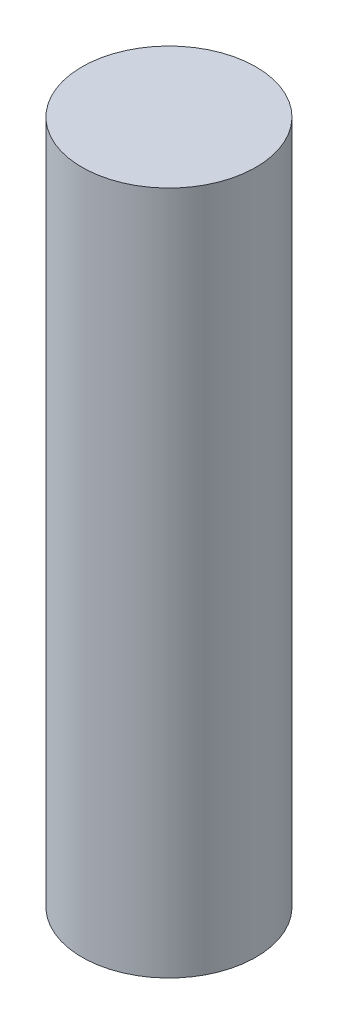
ISO-10303-21;
HEADER;
FILE_DESCRIPTION(('STEP AP214'),'2;1');
FILE_NAME('part.step','',(''),(''),'','','');
FILE_SCHEMA(('AUTOMOTIVE_DESIGN { 1 0 10303 214 1 1 1 1 }'));
ENDSEC;
DATA;
#1=APPLICATION_CONTEXT('core data for automotive mechanical design processes');
#2=APPLICATION_PROTOCOL_DEFINITION('international standard','automotive_design',2000,#1);
#3=PRODUCT_CONTEXT('',#1,'mechanical');
#4=PRODUCT('Part','Part','',(#3));
#5=PRODUCT_RELATED_PRODUCT_CATEGORY('part','',(#4));
#6=PRODUCT_DEFINITION_FORMATION('','',#4);
#7=PRODUCT_DEFINITION_CONTEXT('part definition',#1,'design');
#8=PRODUCT_DEFINITION('design','',#6,#7);
#9=PRODUCT_DEFINITION_SHAPE('','',#8);
#10=(LENGTH_UNIT() NAMED_UNIT(*) SI_UNIT(.MILLI.,.METRE.));
#11=(NAMED_UNIT(*) PLANE_ANGLE_UNIT() SI_UNIT($,.RADIAN.));
#12=(NAMED_UNIT(*) SI_UNIT($,.STERADIAN.) SOLID_ANGLE_UNIT());
#13=UNCERTAINTY_MEASURE_WITH_UNIT(LENGTH_MEASURE(1.E-05),#10,'distance_accuracy_value','');
#14=(GEOMETRIC_REPRESENTATION_CONTEXT(3) GLOBAL_UNCERTAINTY_ASSIGNED_CONTEXT((#13)) GLOBAL_UNIT_ASSIGNED_CONTEXT((#10,
#11,#12)) REPRESENTATION_CONTEXT('',''));
#15=CARTESIAN_POINT('',(0.,0.,0.));
#16=DIRECTION('',(0.,0.,1.));
#17=DIRECTION('',(1.,0.,0.));
#18=AXIS2_PLACEMENT_3D('',#15,#16,#17);
#19=CARTESIAN_POINT('',(0.,114.,0.));
#20=DIRECTION('',(0.,-1.,0.));
#21=DIRECTION('',(0.,0.,-1.));
#22=AXIS2_PLACEMENT_3D('',#19,#20,#21);
#23=CYLINDRICAL_SURFACE('',#22,14.5);
#24=CARTESIAN_POINT('',(0.,114.,0.));
#25=DIRECTION('',(0.,1.,0.));
#26=DIRECTION('',(0.,0.,1.));
#27=AXIS2_PLACEMENT_3D('',#24,#25,#26);
#28=CIRCLE('',#27,14.5);
#29=CARTESIAN_POINT('',(0.,114.,-14.5));
#30=VERTEX_POINT('',#29);
#31=EDGE_CURVE('E10',#30,#30,#28,.T.);
#32=CARTESIAN_POINT('',(0.,0.,0.));
#33=DIRECTION('',(0.,1.,0.));
#34=DIRECTION('',(0.,0.,1.));
#35=AXIS2_PLACEMENT_3D('',#32,#33,#34);
#36=CIRCLE('',#35,14.5);
#37=CARTESIAN_POINT('',(0.,0.,-14.5));
#38=VERTEX_POINT('',#37);
#39=EDGE_CURVE('E42',#38,#38,#36,.T.);
#40=CARTESIAN_POINT('',(0.,114.,-14.5));
#41=CARTESIAN_POINT('',(0.,112.8125,-14.5));
#42=CARTESIAN_POINT('',(0.,111.625,-14.5));
#43=CARTESIAN_POINT('',(0.,109.25,-14.5));
#44=CARTESIAN_POINT('',(0.,108.0625,-14.5));
#45=CARTESIAN_POINT('',(0.,105.6875,-14.5));
#46=CARTESIAN_POINT('',(0.,104.5,-14.5));
#47=CARTESIAN_POINT('',(0.,102.125,-14.5));
#48=CARTESIAN_POINT('',(0.,100.9375,-14.5));
#49=CARTESIAN_POINT('',(0.,98.5625,-14.5));
#50=CARTESIAN_POINT('',(0.,97.375,-14.5));
#51=CARTESIAN_POINT('',(0.,95.,-14.5));
#52=CARTESIAN_POINT('',(0.,93.8125,-14.5));
#53=CARTESIAN_POINT('',(0.,91.4375,-14.5));
#54=CARTESIAN_POINT('',(0.,90.25,-14.5));
#55=CARTESIAN_POINT('',(0.,87.875,-14.5));
#56=CARTESIAN_POINT('',(0.,86.6875,-14.5));
#57=CARTESIAN_POINT('',(0.,84.3125,-14.5));
#58=CARTESIAN_POINT('',(0.,83.125,-14.5));
#59=CARTESIAN_POINT('',(0.,80.75,-14.5));
#60=CARTESIAN_POINT('',(0.,79.5625,-14.5));
#61=CARTESIAN_POINT('',(0.,77.1875,-14.5));
#62=CARTESIAN_POINT('',(0.,76.,-14.5));
#63=CARTESIAN_POINT('',(0.,73.625,-14.5));
#64=CARTESIAN_POINT('',(0.,72.4375,-14.5));
#65=CARTESIAN_POINT('',(0.,70.0625,-14.5));
#66=CARTESIAN_POINT('',(0.,68.875,-14.5));
#67=CARTESIAN_POINT('',(0.,66.5,-14.5));
#68=CARTESIAN_POINT('',(0.,65.3125,-14.5));
#69=CARTESIAN_POINT('',(0.,62.9375,-14.5));
#70=CARTESIAN_POINT('',(0.,61.75,-14.5));
#71=CARTESIAN_POINT('',(0.,59.375,-14.5));
#72=CARTESIAN_POINT('',(0.,58.1875,-14.5));
#73=CARTESIAN_POINT('',(0.,55.8125,-14.5));
#74=CARTESIAN_POINT('',(0.,54.625,-14.5));
#75=CARTESIAN_POINT('',(0.,52.25,-14.5));
#76=CARTESIAN_POINT('',(0.,51.0625,-14.5));
#77=CARTESIAN_POINT('',(0.,48.6875,-14.5));
#78=CARTESIAN_POINT('',(0.,47.5,-14.5));
#79=CARTESIAN_POINT('',(0.,45.125,-14.5));
#80=CARTESIAN_POINT('',(0.,43.9375,-14.5));
#81=CARTESIAN_POINT('',(0.,41.5625,-14.5));
#82=CARTESIAN_POINT('',(0.,40.375,-14.5));
#83=CARTESIAN_POINT('',(0.,38.,-14.5));
#84=CARTESIAN_POINT('',(0.,36.8125,-14.5));
#85=CARTESIAN_POINT('',(0.,34.4375,-14.5));
#86=CARTESIAN_POINT('',(0.,33.25,-14.5));
#87=CARTESIAN_POINT('',(0.,30.875,-14.5));
#88=CARTESIAN_POINT('',(0.,29.6875,-14.5));
#89=CARTESIAN_POINT('',(0.,27.3125,-14.5));
#90=CARTESIAN_POINT('',(0.,26.125,-14.5));
#91=CARTESIAN_POINT('',(0.,23.75,-14.5));
#92=CARTESIAN_POINT('',(0.,22.5625,-14.5));
#93=CARTESIAN_POINT('',(0.,20.1875,-14.5));
#94=CARTESIAN_POINT('',(0.,19.,-14.5));
#95=CARTESIAN_POINT('',(0.,16.625,-14.5));
#96=CARTESIAN_POINT('',(0.,15.4375,-14.5));
#97=CARTESIAN_POINT('',(0.,13.0625,-14.5));
#98=CARTESIAN_POINT('',(0.,11.875,-14.5));
#99=CARTESIAN_POINT('',(0.,9.5,-14.5));
#100=CARTESIAN_POINT('',(0.,8.31250000000001,-14.5));
#101=CARTESIAN_POINT('',(0.,5.9375,-14.5));
#102=CARTESIAN_POINT('',(0.,4.75,-14.5));
#103=CARTESIAN_POINT('',(0.,2.375,-14.5));
#104=CARTESIAN_POINT('',(0.,1.1875,-14.5));
#105=CARTESIAN_POINT('',(0.,0.,-14.5));
#106=B_SPLINE_CURVE_WITH_KNOTS('',3,(#40,#41,#42,#43,#44,#45,#46,#47,#48,#49,#50,#51,#52,#53,
#54,#55,#56,#57,#58,#59,#60,#61,#62,#63,#64,#65,#66,#67,#68,#69,#70,#71,#72,#73,#74,#75,#76,#77,
#78,#79,#80,#81,#82,#83,#84,#85,#86,#87,#88,#89,#90,#91,#92,#93,#94,#95,#96,#97,#98,#99,#100,
#101,#102,#103,#104,#105),.UNSPECIFIED.,.F.,.F.,(4,2,2,2,2,2,2,2,2,2,2,2,2,2,2,2,2,2,2,2,2,2,2,
2,2,2,2,2,2,2,2,2,4),(0.,3.56250000000001,7.12500000000001,10.6875,14.25,17.8125,21.375,24.9375,
28.5,32.0625,35.625,39.1875,42.75,46.3125,49.875,53.4375,57.,60.5625,64.125,67.6875,71.25,
74.8125,78.375,81.9375,85.5,89.0625,92.625,96.1875,99.75,103.3125,106.875,110.4375,114.),.UNSPECIFIED.);
#107=EDGE_CURVE('BSEAM39',#30,#38,#106,.T.);
#108=ORIENTED_EDGE('',*,*,#31,.F.);
#109=ORIENTED_EDGE('',*,*,#39,.T.);
#110=ORIENTED_EDGE('',*,*,#107,.T.);
#111=ORIENTED_EDGE('',*,*,#107,.F.);
#112=EDGE_LOOP('',(#108,#110,#109,#111));
#113=FACE_BOUND('',#112,.T.);
#114=ADVANCED_FACE('F39',(#113),#23,.T.);
#115=CARTESIAN_POINT('',(0.,114.,0.));
#116=DIRECTION('',(0.,1.,0.));
#117=DIRECTION('',(0.,0.,1.));
#118=AXIS2_PLACEMENT_3D('',#115,#116,#117);
#119=PLANE('',#118);
#120=ORIENTED_EDGE('',*,*,#31,.T.);
#121=EDGE_LOOP('',(#120));
#122=FACE_BOUND('',#121,.T.);
#123=ADVANCED_FACE('F73',(#122),#119,.T.);
#124=CARTESIAN_POINT('',(0.,0.,0.));
#125=DIRECTION('',(0.,1.,0.));
#126=DIRECTION('',(0.,0.,1.));
#127=AXIS2_PLACEMENT_3D('',#124,#125,#126);
#128=PLANE('',#127);
#129=CARTESIAN_POINT('',(0.,0.,0.));
#130=DIRECTION('',(0.,1.,0.));
#131=DIRECTION('',(0.,0.,1.));
#132=AXIS2_PLACEMENT_3D('',#129,#130,#131);
#133=CIRCLE('',#132,12.5);
#134=CARTESIAN_POINT('',(0.,0.,12.5));
#135=VERTEX_POINT('',#134);
#136=EDGE_CURVE('E53',#135,#135,#133,.T.);
#137=ORIENTED_EDGE('',*,*,#136,.T.);
#138=EDGE_LOOP('',(#137));
#139=FACE_BOUND('',#138,.T.);
#140=ORIENTED_EDGE('',*,*,#39,.F.);
#141=EDGE_LOOP('',(#140));
#142=FACE_BOUND('',#141,.T.);
#143=ADVANCED_FACE('F70',(#139,#142),#128,.F.);
#144=CARTESIAN_POINT('',(0.,105.,0.));
#145=DIRECTION('',(0.,-1.,0.));
#146=DIRECTION('',(0.,0.,-1.));
#147=AXIS2_PLACEMENT_3D('',#144,#145,#146);
#148=CYLINDRICAL_SURFACE('',#147,12.5);
#149=CARTESIAN_POINT('',(0.,105.,0.));
#150=DIRECTION('',(0.,1.,0.));
#151=DIRECTION('',(0.,0.,1.));
#152=AXIS2_PLACEMENT_3D('',#149,#150,#151);
#153=CIRCLE('',#152,12.5);
#154=CARTESIAN_POINT('',(0.,105.,12.5));
#155=VERTEX_POINT('',#154);
#156=EDGE_CURVE('E51',#155,#155,#153,.T.);
#157=ORIENTED_EDGE('',*,*,#156,.T.);
#158=EDGE_LOOP('',(#157));
#159=FACE_BOUND('',#158,.T.);
#160=ORIENTED_EDGE('',*,*,#136,.F.);
#161=EDGE_LOOP('',(#160));
#162=FACE_BOUND('',#161,.T.);
#163=ADVANCED_FACE('F61',(#159,#162),#148,.F.);
#164=CARTESIAN_POINT('',(0.,105.,0.));
#165=DIRECTION('',(0.,1.,0.));
#166=DIRECTION('',(0.,0.,1.));
#167=AXIS2_PLACEMENT_3D('',#164,#165,#166);
#168=PLANE('',#167);
#169=ORIENTED_EDGE('',*,*,#156,.F.);
#170=EDGE_LOOP('',(#169));
#171=FACE_BOUND('',#170,.T.);
#172=ADVANCED_FACE('F64',(#171),#168,.F.);
#173=CLOSED_SHELL('',(#114,#123,#143,#163,#172));
#174=MANIFOLD_SOLID_BREP('B2',#173);
#175=ADVANCED_BREP_SHAPE_REPRESENTATION('',(#18,#174),#14);
#176=SHAPE_DEFINITION_REPRESENTATION(#9,#175);
ENDSEC;
END-ISO-10303-21;
